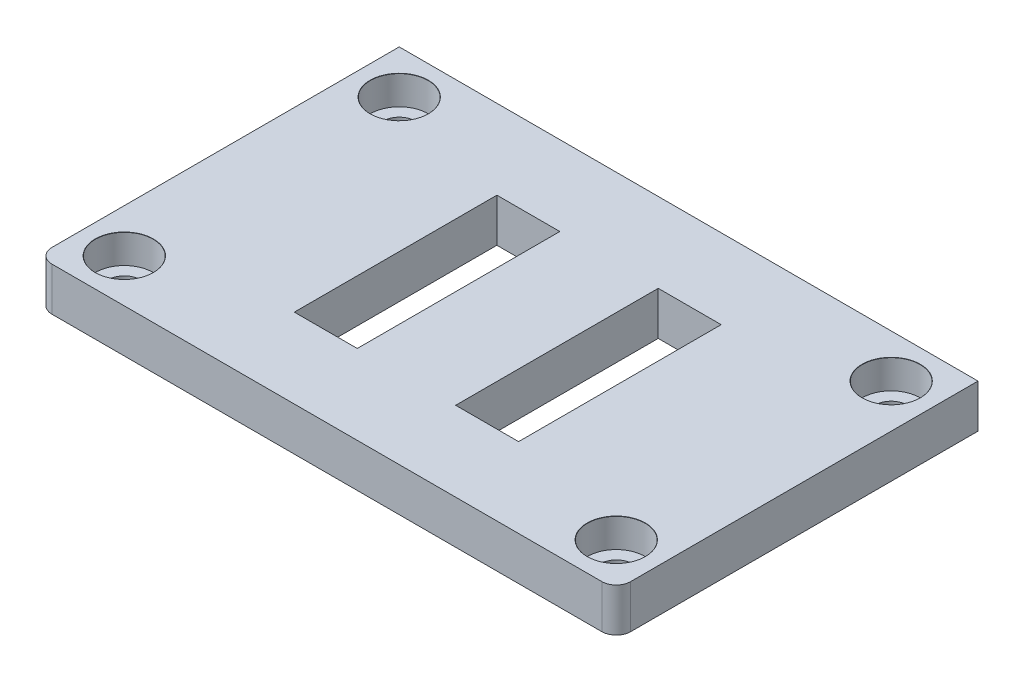
ISO-10303-21;
HEADER;
FILE_DESCRIPTION(('STEP AP214'),'2;1');
FILE_NAME('part.step','',(''),(''),'','','');
FILE_SCHEMA(('AUTOMOTIVE_DESIGN { 1 0 10303 214 1 1 1 1 }'));
ENDSEC;
DATA;
#1=APPLICATION_CONTEXT('core data for automotive mechanical design processes');
#2=APPLICATION_PROTOCOL_DEFINITION('international standard','automotive_design',2000,#1);
#3=PRODUCT_CONTEXT('',#1,'mechanical');
#4=PRODUCT('Part','Part','',(#3));
#5=PRODUCT_RELATED_PRODUCT_CATEGORY('part','',(#4));
#6=PRODUCT_DEFINITION_FORMATION('','',#4);
#7=PRODUCT_DEFINITION_CONTEXT('part definition',#1,'design');
#8=PRODUCT_DEFINITION('design','',#6,#7);
#9=PRODUCT_DEFINITION_SHAPE('','',#8);
#10=(LENGTH_UNIT() NAMED_UNIT(*) SI_UNIT(.MILLI.,.METRE.));
#11=(NAMED_UNIT(*) PLANE_ANGLE_UNIT() SI_UNIT($,.RADIAN.));
#12=(NAMED_UNIT(*) SI_UNIT($,.STERADIAN.) SOLID_ANGLE_UNIT());
#13=UNCERTAINTY_MEASURE_WITH_UNIT(LENGTH_MEASURE(1.E-05),#10,'distance_accuracy_value','');
#14=(GEOMETRIC_REPRESENTATION_CONTEXT(3) GLOBAL_UNCERTAINTY_ASSIGNED_CONTEXT((#13)) GLOBAL_UNIT_ASSIGNED_CONTEXT((#10,
#11,#12)) REPRESENTATION_CONTEXT('',''));
#15=CARTESIAN_POINT('',(0.,0.,0.));
#16=DIRECTION('',(0.,0.,1.));
#17=DIRECTION('',(1.,0.,0.));
#18=AXIS2_PLACEMENT_3D('',#15,#16,#17);
#19=CARTESIAN_POINT('',(0.,6.,0.));
#20=DIRECTION('',(0.,1.,0.));
#21=DIRECTION('',(0.,0.,1.));
#22=AXIS2_PLACEMENT_3D('',#19,#20,#21);
#23=PLANE('',#22);
#24=CARTESIAN_POINT('',(54.,6.,19.));
#25=DIRECTION('',(0.,1.,0.));
#26=DIRECTION('',(0.,0.,1.));
#27=AXIS2_PLACEMENT_3D('',#24,#25,#26);
#28=CIRCLE('',#27,4.025);
#29=CARTESIAN_POINT('',(54.,6.,23.025));
#30=VERTEX_POINT('',#29);
#31=EDGE_CURVE('E498',#30,#30,#28,.T.);
#32=ORIENTED_EDGE('',*,*,#31,.F.);
#33=EDGE_LOOP('',(#32));
#34=FACE_BOUND('',#33,.T.);
#35=CARTESIAN_POINT('',(54.,6.,-19.));
#36=DIRECTION('',(0.,1.,0.));
#37=DIRECTION('',(0.,0.,1.));
#38=AXIS2_PLACEMENT_3D('',#35,#36,#37);
#39=CIRCLE('',#38,4.025);
#40=CARTESIAN_POINT('',(54.,6.,-14.975));
#41=VERTEX_POINT('',#40);
#42=EDGE_CURVE('E516',#41,#41,#39,.T.);
#43=ORIENTED_EDGE('',*,*,#42,.F.);
#44=EDGE_LOOP('',(#43));
#45=FACE_BOUND('',#44,.T.);
#46=CARTESIAN_POINT('',(-14.,6.,19.));
#47=DIRECTION('',(0.,1.,0.));
#48=DIRECTION('',(0.,0.,1.));
#49=AXIS2_PLACEMENT_3D('',#46,#47,#48);
#50=CIRCLE('',#49,4.025);
#51=CARTESIAN_POINT('',(-14.,6.,23.025));
#52=VERTEX_POINT('',#51);
#53=EDGE_CURVE('E212',#52,#52,#50,.T.);
#54=ORIENTED_EDGE('',*,*,#53,.F.);
#55=EDGE_LOOP('',(#54));
#56=FACE_BOUND('',#55,.T.);
#57=CARTESIAN_POINT('',(-14.,6.,-19.));
#58=DIRECTION('',(0.,1.,0.));
#59=DIRECTION('',(0.,0.,1.));
#60=AXIS2_PLACEMENT_3D('',#57,#58,#59);
#61=CIRCLE('',#60,4.025);
#62=CARTESIAN_POINT('',(-14.,6.,-14.975));
#63=VERTEX_POINT('',#62);
#64=EDGE_CURVE('E232',#63,#63,#61,.T.);
#65=ORIENTED_EDGE('',*,*,#64,.F.);
#66=EDGE_LOOP('',(#65));
#67=FACE_BOUND('',#66,.T.);
#68=DIRECTION('',(1.,0.,0.));
#69=VECTOR('',#68,1.);
#70=CARTESIAN_POINT('',(-20.,6.,25.));
#71=LINE('',#70,#69);
#72=CARTESIAN_POINT('',(-18.,6.,25.));
#73=VERTEX_POINT('',#72);
#74=CARTESIAN_POINT('',(58.,6.,25.));
#75=VERTEX_POINT('',#74);
#76=EDGE_CURVE('E303',#73,#75,#71,.T.);
#77=ORIENTED_EDGE('',*,*,#76,.T.);
#78=CARTESIAN_POINT('',(58.,6.,23.));
#79=DIRECTION('',(0.,1.,0.));
#80=DIRECTION('',(0.,0.,1.));
#81=AXIS2_PLACEMENT_3D('',#78,#79,#80);
#82=CIRCLE('',#81,2.);
#83=CARTESIAN_POINT('',(60.,6.,23.));
#84=VERTEX_POINT('',#83);
#85=EDGE_CURVE('E51',#75,#84,#82,.T.);
#86=ORIENTED_EDGE('',*,*,#85,.T.);
#87=DIRECTION('',(0.,0.,1.));
#88=VECTOR('',#87,1.);
#89=CARTESIAN_POINT('',(60.,6.,-25.));
#90=LINE('',#89,#88);
#91=CARTESIAN_POINT('',(60.,6.,-25.));
#92=VERTEX_POINT('',#91);
#93=EDGE_CURVE('E201',#92,#84,#90,.T.);
#94=ORIENTED_EDGE('',*,*,#93,.F.);
#95=DIRECTION('',(-1.,0.,0.));
#96=VECTOR('',#95,1.);
#97=CARTESIAN_POINT('',(-20.,6.,-25.));
#98=LINE('',#97,#96);
#99=CARTESIAN_POINT('',(-20.,6.,-25.));
#100=VERTEX_POINT('',#99);
#101=EDGE_CURVE('E296',#92,#100,#98,.T.);
#102=ORIENTED_EDGE('',*,*,#101,.T.);
#103=DIRECTION('',(0.,0.,1.));
#104=VECTOR('',#103,1.);
#105=CARTESIAN_POINT('',(-20.,6.,-25.));
#106=LINE('',#105,#104);
#107=CARTESIAN_POINT('',(-20.,6.,23.));
#108=VERTEX_POINT('',#107);
#109=EDGE_CURVE('E299',#100,#108,#106,.T.);
#110=ORIENTED_EDGE('',*,*,#109,.T.);
#111=CARTESIAN_POINT('',(-18.,6.,23.));
#112=DIRECTION('',(0.,1.,0.));
#113=DIRECTION('',(0.,0.,1.));
#114=AXIS2_PLACEMENT_3D('',#111,#112,#113);
#115=CIRCLE('',#114,2.);
#116=EDGE_CURVE('E333',#108,#73,#115,.T.);
#117=ORIENTED_EDGE('',*,*,#116,.T.);
#118=EDGE_LOOP('',(#77,#86,#94,#102,#110,#117));
#119=FACE_BOUND('',#118,.T.);
#120=DIRECTION('',(0.,0.,-1.));
#121=VECTOR('',#120,1.);
#122=CARTESIAN_POINT('',(13.2,6.,-14.));
#123=LINE('',#122,#121);
#124=CARTESIAN_POINT('',(13.2,6.,14.));
#125=VERTEX_POINT('',#124);
#126=CARTESIAN_POINT('',(13.2,6.,-14.));
#127=VERTEX_POINT('',#126);
#128=EDGE_CURVE('E256',#125,#127,#123,.T.);
#129=ORIENTED_EDGE('',*,*,#128,.F.);
#130=DIRECTION('',(1.,0.,0.));
#131=VECTOR('',#130,1.);
#132=CARTESIAN_POINT('',(4.5,6.,14.));
#133=LINE('',#132,#131);
#134=CARTESIAN_POINT('',(4.5,6.,14.));
#135=VERTEX_POINT('',#134);
#136=EDGE_CURVE('E253',#135,#125,#133,.T.);
#137=ORIENTED_EDGE('',*,*,#136,.F.);
#138=DIRECTION('',(0.,0.,1.));
#139=VECTOR('',#138,1.);
#140=CARTESIAN_POINT('',(4.5,6.,14.));
#141=LINE('',#140,#139);
#142=CARTESIAN_POINT('',(4.5,6.,-14.));
#143=VERTEX_POINT('',#142);
#144=EDGE_CURVE('E264',#143,#135,#141,.T.);
#145=ORIENTED_EDGE('',*,*,#144,.F.);
#146=DIRECTION('',(-1.,0.,0.));
#147=VECTOR('',#146,1.);
#148=CARTESIAN_POINT('',(13.2,6.,-14.));
#149=LINE('',#148,#147);
#150=EDGE_CURVE('E260',#127,#143,#149,.T.);
#151=ORIENTED_EDGE('',*,*,#150,.F.);
#152=EDGE_LOOP('',(#129,#137,#145,#151));
#153=FACE_BOUND('',#152,.T.);
#154=DIRECTION('',(-1.,0.,0.));
#155=VECTOR('',#154,1.);
#156=CARTESIAN_POINT('',(35.5,6.,14.));
#157=LINE('',#156,#155);
#158=CARTESIAN_POINT('',(35.5,6.,14.));
#159=VERTEX_POINT('',#158);
#160=CARTESIAN_POINT('',(26.8,6.,14.));
#161=VERTEX_POINT('',#160);
#162=EDGE_CURVE('E161',#159,#161,#157,.T.);
#163=ORIENTED_EDGE('',*,*,#162,.T.);
#164=DIRECTION('',(0.,0.,-1.));
#165=VECTOR('',#164,1.);
#166=CARTESIAN_POINT('',(26.8,6.,-14.));
#167=LINE('',#166,#165);
#168=CARTESIAN_POINT('',(26.8,6.,-14.));
#169=VERTEX_POINT('',#168);
#170=EDGE_CURVE('E175',#161,#169,#167,.T.);
#171=ORIENTED_EDGE('',*,*,#170,.T.);
#172=DIRECTION('',(1.,0.,0.));
#173=VECTOR('',#172,1.);
#174=CARTESIAN_POINT('',(26.8,6.,-14.));
#175=LINE('',#174,#173);
#176=CARTESIAN_POINT('',(35.5,6.,-14.));
#177=VERTEX_POINT('',#176);
#178=EDGE_CURVE('E171',#169,#177,#175,.T.);
#179=ORIENTED_EDGE('',*,*,#178,.T.);
#180=DIRECTION('',(0.,0.,1.));
#181=VECTOR('',#180,1.);
#182=CARTESIAN_POINT('',(35.5,6.,14.));
#183=LINE('',#182,#181);
#184=EDGE_CURVE('E150',#177,#159,#183,.T.);
#185=ORIENTED_EDGE('',*,*,#184,.T.);
#186=EDGE_LOOP('',(#163,#171,#179,#185));
#187=FACE_BOUND('',#186,.T.);
#188=ADVANCED_FACE('F42',(#34,#45,#56,#67,#119,#153,#187),#23,.T.);
#189=CARTESIAN_POINT('',(0.,0.,0.));
#190=DIRECTION('',(0.,1.,0.));
#191=DIRECTION('',(0.,0.,1.));
#192=AXIS2_PLACEMENT_3D('',#189,#190,#191);
#193=PLANE('',#192);
#194=CARTESIAN_POINT('',(54.,0.,19.));
#195=DIRECTION('',(0.,1.,0.));
#196=DIRECTION('',(0.,0.,1.));
#197=AXIS2_PLACEMENT_3D('',#194,#195,#196);
#198=CIRCLE('',#197,2.25);
#199=CARTESIAN_POINT('',(54.,0.,21.25));
#200=VERTEX_POINT('',#199);
#201=EDGE_CURVE('E512',#200,#200,#198,.T.);
#202=ORIENTED_EDGE('',*,*,#201,.T.);
#203=EDGE_LOOP('',(#202));
#204=FACE_BOUND('',#203,.T.);
#205=CARTESIAN_POINT('',(54.,0.,-19.));
#206=DIRECTION('',(0.,1.,0.));
#207=DIRECTION('',(0.,0.,1.));
#208=AXIS2_PLACEMENT_3D('',#205,#206,#207);
#209=CIRCLE('',#208,2.25);
#210=CARTESIAN_POINT('',(54.,0.,-16.75));
#211=VERTEX_POINT('',#210);
#212=EDGE_CURVE('E184',#211,#211,#209,.T.);
#213=ORIENTED_EDGE('',*,*,#212,.T.);
#214=EDGE_LOOP('',(#213));
#215=FACE_BOUND('',#214,.T.);
#216=CARTESIAN_POINT('',(-14.,0.,19.));
#217=DIRECTION('',(0.,1.,0.));
#218=DIRECTION('',(0.,0.,1.));
#219=AXIS2_PLACEMENT_3D('',#216,#217,#218);
#220=CIRCLE('',#219,2.25);
#221=CARTESIAN_POINT('',(-14.,0.,21.25));
#222=VERTEX_POINT('',#221);
#223=EDGE_CURVE('E228',#222,#222,#220,.T.);
#224=ORIENTED_EDGE('',*,*,#223,.T.);
#225=EDGE_LOOP('',(#224));
#226=FACE_BOUND('',#225,.T.);
#227=CARTESIAN_POINT('',(-14.,0.,-19.));
#228=DIRECTION('',(0.,1.,0.));
#229=DIRECTION('',(0.,0.,1.));
#230=AXIS2_PLACEMENT_3D('',#227,#228,#229);
#231=CIRCLE('',#230,2.25);
#232=CARTESIAN_POINT('',(-14.,0.,-16.75));
#233=VERTEX_POINT('',#232);
#234=EDGE_CURVE('E248',#233,#233,#231,.T.);
#235=ORIENTED_EDGE('',*,*,#234,.T.);
#236=EDGE_LOOP('',(#235));
#237=FACE_BOUND('',#236,.T.);
#238=DIRECTION('',(0.,0.,1.));
#239=VECTOR('',#238,1.);
#240=CARTESIAN_POINT('',(60.,0.,-25.));
#241=LINE('',#240,#239);
#242=CARTESIAN_POINT('',(60.,0.,-25.));
#243=VERTEX_POINT('',#242);
#244=CARTESIAN_POINT('',(60.,0.,23.));
#245=VERTEX_POINT('',#244);
#246=EDGE_CURVE('E157',#243,#245,#241,.T.);
#247=ORIENTED_EDGE('',*,*,#246,.T.);
#248=CARTESIAN_POINT('',(58.,0.,23.));
#249=DIRECTION('',(0.,1.,0.));
#250=DIRECTION('',(0.,0.,1.));
#251=AXIS2_PLACEMENT_3D('',#248,#249,#250);
#252=CIRCLE('',#251,2.);
#253=CARTESIAN_POINT('',(58.,0.,25.));
#254=VERTEX_POINT('',#253);
#255=EDGE_CURVE('E324',#245,#254,#252,.F.);
#256=ORIENTED_EDGE('',*,*,#255,.T.);
#257=DIRECTION('',(1.,0.,0.));
#258=VECTOR('',#257,1.);
#259=CARTESIAN_POINT('',(-20.,0.,25.));
#260=LINE('',#259,#258);
#261=CARTESIAN_POINT('',(-18.,0.,25.));
#262=VERTEX_POINT('',#261);
#263=EDGE_CURVE('E300',#262,#254,#260,.T.);
#264=ORIENTED_EDGE('',*,*,#263,.F.);
#265=CARTESIAN_POINT('',(-18.,0.,23.));
#266=DIRECTION('',(0.,1.,0.));
#267=DIRECTION('',(0.,0.,1.));
#268=AXIS2_PLACEMENT_3D('',#265,#266,#267);
#269=CIRCLE('',#268,2.);
#270=CARTESIAN_POINT('',(-20.,0.,23.));
#271=VERTEX_POINT('',#270);
#272=EDGE_CURVE('E321',#262,#271,#269,.F.);
#273=ORIENTED_EDGE('',*,*,#272,.T.);
#274=DIRECTION('',(0.,0.,1.));
#275=VECTOR('',#274,1.);
#276=CARTESIAN_POINT('',(-20.,0.,-25.));
#277=LINE('',#276,#275);
#278=CARTESIAN_POINT('',(-20.,0.,-25.));
#279=VERTEX_POINT('',#278);
#280=EDGE_CURVE('E309',#279,#271,#277,.T.);
#281=ORIENTED_EDGE('',*,*,#280,.F.);
#282=DIRECTION('',(-1.,0.,0.));
#283=VECTOR('',#282,1.);
#284=CARTESIAN_POINT('',(-20.,0.,-25.));
#285=LINE('',#284,#283);
#286=EDGE_CURVE('E295',#243,#279,#285,.T.);
#287=ORIENTED_EDGE('',*,*,#286,.F.);
#288=EDGE_LOOP('',(#247,#256,#264,#273,#281,#287));
#289=FACE_BOUND('',#288,.T.);
#290=DIRECTION('',(1.,0.,0.));
#291=VECTOR('',#290,1.);
#292=CARTESIAN_POINT('',(4.5,0.,14.));
#293=LINE('',#292,#291);
#294=CARTESIAN_POINT('',(4.5,0.,14.));
#295=VERTEX_POINT('',#294);
#296=CARTESIAN_POINT('',(13.2,0.,14.));
#297=VERTEX_POINT('',#296);
#298=EDGE_CURVE('E252',#295,#297,#293,.T.);
#299=ORIENTED_EDGE('',*,*,#298,.T.);
#300=DIRECTION('',(0.,0.,-1.));
#301=VECTOR('',#300,1.);
#302=CARTESIAN_POINT('',(13.2,0.,-14.));
#303=LINE('',#302,#301);
#304=CARTESIAN_POINT('',(13.2,0.,-14.));
#305=VERTEX_POINT('',#304);
#306=EDGE_CURVE('E271',#297,#305,#303,.T.);
#307=ORIENTED_EDGE('',*,*,#306,.T.);
#308=DIRECTION('',(-1.,0.,0.));
#309=VECTOR('',#308,1.);
#310=CARTESIAN_POINT('',(13.2,0.,-14.));
#311=LINE('',#310,#309);
#312=CARTESIAN_POINT('',(4.5,0.,-14.));
#313=VERTEX_POINT('',#312);
#314=EDGE_CURVE('E275',#305,#313,#311,.T.);
#315=ORIENTED_EDGE('',*,*,#314,.T.);
#316=DIRECTION('',(0.,0.,1.));
#317=VECTOR('',#316,1.);
#318=CARTESIAN_POINT('',(4.5,0.,14.));
#319=LINE('',#318,#317);
#320=EDGE_CURVE('E257',#313,#295,#319,.T.);
#321=ORIENTED_EDGE('',*,*,#320,.T.);
#322=EDGE_LOOP('',(#299,#307,#315,#321));
#323=FACE_BOUND('',#322,.T.);
#324=DIRECTION('',(0.,0.,-1.));
#325=VECTOR('',#324,1.);
#326=CARTESIAN_POINT('',(26.8,0.,-14.));
#327=LINE('',#326,#325);
#328=CARTESIAN_POINT('',(26.8,0.,14.));
#329=VERTEX_POINT('',#328);
#330=CARTESIAN_POINT('',(26.8,0.,-14.));
#331=VERTEX_POINT('',#330);
#332=EDGE_CURVE('E169',#329,#331,#327,.T.);
#333=ORIENTED_EDGE('',*,*,#332,.F.);
#334=DIRECTION('',(-1.,0.,0.));
#335=VECTOR('',#334,1.);
#336=CARTESIAN_POINT('',(35.5,0.,14.));
#337=LINE('',#336,#335);
#338=CARTESIAN_POINT('',(35.5,0.,14.));
#339=VERTEX_POINT('',#338);
#340=EDGE_CURVE('E181',#339,#329,#337,.T.);
#341=ORIENTED_EDGE('',*,*,#340,.F.);
#342=DIRECTION('',(0.,0.,1.));
#343=VECTOR('',#342,1.);
#344=CARTESIAN_POINT('',(35.5,0.,14.));
#345=LINE('',#344,#343);
#346=CARTESIAN_POINT('',(35.5,0.,-14.));
#347=VERTEX_POINT('',#346);
#348=EDGE_CURVE('E153',#347,#339,#345,.T.);
#349=ORIENTED_EDGE('',*,*,#348,.F.);
#350=DIRECTION('',(1.,0.,0.));
#351=VECTOR('',#350,1.);
#352=CARTESIAN_POINT('',(26.8,0.,-14.));
#353=LINE('',#352,#351);
#354=EDGE_CURVE('E187',#331,#347,#353,.T.);
#355=ORIENTED_EDGE('',*,*,#354,.F.);
#356=EDGE_LOOP('',(#333,#341,#349,#355));
#357=FACE_BOUND('',#356,.T.);
#358=ADVANCED_FACE('F349',(#204,#215,#226,#237,#289,#323,#357),#193,.F.);
#359=CARTESIAN_POINT('',(-20.,6.,-25.));
#360=DIRECTION('',(0.,0.,1.));
#361=DIRECTION('',(1.,0.,0.));
#362=AXIS2_PLACEMENT_3D('',#359,#360,#361);
#363=PLANE('',#362);
#364=ORIENTED_EDGE('',*,*,#286,.T.);
#365=DIRECTION('',(0.,-1.,0.));
#366=VECTOR('',#365,1.);
#367=CARTESIAN_POINT('',(-20.,6.,-25.));
#368=LINE('',#367,#366);
#369=EDGE_CURVE('E306',#100,#279,#368,.T.);
#370=ORIENTED_EDGE('',*,*,#369,.F.);
#371=ORIENTED_EDGE('',*,*,#101,.F.);
#372=DIRECTION('',(0.,-1.,0.));
#373=VECTOR('',#372,1.);
#374=CARTESIAN_POINT('',(60.,6.,-25.));
#375=LINE('',#374,#373);
#376=EDGE_CURVE('E205',#92,#243,#375,.T.);
#377=ORIENTED_EDGE('',*,*,#376,.T.);
#378=EDGE_LOOP('',(#364,#370,#371,#377));
#379=FACE_BOUND('',#378,.T.);
#380=ADVANCED_FACE('F359',(#379),#363,.F.);
#381=CARTESIAN_POINT('',(-20.,6.,-25.));
#382=DIRECTION('',(1.,0.,0.));
#383=DIRECTION('',(0.,0.,-1.));
#384=AXIS2_PLACEMENT_3D('',#381,#382,#383);
#385=PLANE('',#384);
#386=ORIENTED_EDGE('',*,*,#280,.T.);
#387=DIRECTION('',(0.,-1.,0.));
#388=VECTOR('',#387,1.);
#389=CARTESIAN_POINT('',(-20.,6.,23.));
#390=LINE('',#389,#388);
#391=EDGE_CURVE('E11',#271,#108,#390,.F.);
#392=ORIENTED_EDGE('',*,*,#391,.T.);
#393=ORIENTED_EDGE('',*,*,#109,.F.);
#394=ORIENTED_EDGE('',*,*,#369,.T.);
#395=EDGE_LOOP('',(#386,#392,#393,#394));
#396=FACE_BOUND('',#395,.T.);
#397=ADVANCED_FACE('F356',(#396),#385,.F.);
#398=CARTESIAN_POINT('',(-20.,6.,25.));
#399=DIRECTION('',(0.,0.,-1.));
#400=DIRECTION('',(-1.,0.,0.));
#401=AXIS2_PLACEMENT_3D('',#398,#399,#400);
#402=PLANE('',#401);
#403=ORIENTED_EDGE('',*,*,#263,.T.);
#404=DIRECTION('',(0.,-1.,0.));
#405=VECTOR('',#404,1.);
#406=CARTESIAN_POINT('',(58.,6.,25.));
#407=LINE('',#406,#405);
#408=EDGE_CURVE('E64',#254,#75,#407,.F.);
#409=ORIENTED_EDGE('',*,*,#408,.T.);
#410=ORIENTED_EDGE('',*,*,#76,.F.);
#411=DIRECTION('',(0.,-1.,0.));
#412=VECTOR('',#411,1.);
#413=CARTESIAN_POINT('',(-18.,6.,25.));
#414=LINE('',#413,#412);
#415=EDGE_CURVE('E327',#73,#262,#414,.T.);
#416=ORIENTED_EDGE('',*,*,#415,.T.);
#417=EDGE_LOOP('',(#403,#409,#410,#416));
#418=FACE_BOUND('',#417,.T.);
#419=ADVANCED_FACE('F351',(#418),#402,.F.);
#420=CARTESIAN_POINT('',(4.5,6.,14.));
#421=DIRECTION('',(0.,0.,-1.));
#422=DIRECTION('',(-1.,0.,0.));
#423=AXIS2_PLACEMENT_3D('',#420,#421,#422);
#424=PLANE('',#423);
#425=ORIENTED_EDGE('',*,*,#298,.F.);
#426=DIRECTION('',(0.,-1.,0.));
#427=VECTOR('',#426,1.);
#428=CARTESIAN_POINT('',(4.5,6.,14.));
#429=LINE('',#428,#427);
#430=EDGE_CURVE('E267',#135,#295,#429,.T.);
#431=ORIENTED_EDGE('',*,*,#430,.F.);
#432=ORIENTED_EDGE('',*,*,#136,.T.);
#433=DIRECTION('',(0.,-1.,0.));
#434=VECTOR('',#433,1.);
#435=CARTESIAN_POINT('',(13.2,6.,14.));
#436=LINE('',#435,#434);
#437=EDGE_CURVE('E291',#125,#297,#436,.T.);
#438=ORIENTED_EDGE('',*,*,#437,.T.);
#439=EDGE_LOOP('',(#425,#431,#432,#438));
#440=FACE_BOUND('',#439,.T.);
#441=ADVANCED_FACE('F380',(#440),#424,.T.);
#442=CARTESIAN_POINT('',(13.2,6.,-14.));
#443=DIRECTION('',(-1.,0.,0.));
#444=DIRECTION('',(0.,0.,1.));
#445=AXIS2_PLACEMENT_3D('',#442,#443,#444);
#446=PLANE('',#445);
#447=ORIENTED_EDGE('',*,*,#306,.F.);
#448=ORIENTED_EDGE('',*,*,#437,.F.);
#449=ORIENTED_EDGE('',*,*,#128,.T.);
#450=DIRECTION('',(0.,-1.,0.));
#451=VECTOR('',#450,1.);
#452=CARTESIAN_POINT('',(13.2,6.,-14.));
#453=LINE('',#452,#451);
#454=EDGE_CURVE('E288',#127,#305,#453,.T.);
#455=ORIENTED_EDGE('',*,*,#454,.T.);
#456=EDGE_LOOP('',(#447,#448,#449,#455));
#457=FACE_BOUND('',#456,.T.);
#458=ADVANCED_FACE('F388',(#457),#446,.T.);
#459=CARTESIAN_POINT('',(13.2,6.,-14.));
#460=DIRECTION('',(0.,0.,1.));
#461=DIRECTION('',(1.,0.,0.));
#462=AXIS2_PLACEMENT_3D('',#459,#460,#461);
#463=PLANE('',#462);
#464=ORIENTED_EDGE('',*,*,#314,.F.);
#465=ORIENTED_EDGE('',*,*,#454,.F.);
#466=ORIENTED_EDGE('',*,*,#150,.T.);
#467=DIRECTION('',(0.,-1.,0.));
#468=VECTOR('',#467,1.);
#469=CARTESIAN_POINT('',(4.5,6.,-14.));
#470=LINE('',#469,#468);
#471=EDGE_CURVE('E285',#143,#313,#470,.T.);
#472=ORIENTED_EDGE('',*,*,#471,.T.);
#473=EDGE_LOOP('',(#464,#465,#466,#472));
#474=FACE_BOUND('',#473,.T.);
#475=ADVANCED_FACE('F393',(#474),#463,.T.);
#476=CARTESIAN_POINT('',(4.5,6.,14.));
#477=DIRECTION('',(1.,0.,0.));
#478=DIRECTION('',(0.,0.,-1.));
#479=AXIS2_PLACEMENT_3D('',#476,#477,#478);
#480=PLANE('',#479);
#481=ORIENTED_EDGE('',*,*,#320,.F.);
#482=ORIENTED_EDGE('',*,*,#471,.F.);
#483=ORIENTED_EDGE('',*,*,#144,.T.);
#484=ORIENTED_EDGE('',*,*,#430,.T.);
#485=EDGE_LOOP('',(#481,#482,#483,#484));
#486=FACE_BOUND('',#485,.T.);
#487=ADVANCED_FACE('F400',(#486),#480,.T.);
#488=CARTESIAN_POINT('',(-14.,6.,-19.));
#489=DIRECTION('',(0.,1.,0.));
#490=DIRECTION('',(0.,0.,1.));
#491=AXIS2_PLACEMENT_3D('',#488,#489,#490);
#492=CYLINDRICAL_SURFACE('',#491,2.25);
#493=ORIENTED_EDGE('',*,*,#234,.F.);
#494=EDGE_LOOP('',(#493));
#495=FACE_BOUND('',#494,.T.);
#496=CARTESIAN_POINT('',(-14.,2.,-19.));
#497=DIRECTION('',(0.,1.,0.));
#498=DIRECTION('',(0.,0.,1.));
#499=AXIS2_PLACEMENT_3D('',#496,#497,#498);
#500=CIRCLE('',#499,2.25);
#501=CARTESIAN_POINT('',(-14.,2.,-16.75));
#502=VERTEX_POINT('',#501);
#503=EDGE_CURVE('E244',#502,#502,#500,.T.);
#504=ORIENTED_EDGE('',*,*,#503,.T.);
#505=EDGE_LOOP('',(#504));
#506=FACE_BOUND('',#505,.T.);
#507=ADVANCED_FACE('F413',(#495,#506),#492,.F.);
#508=CARTESIAN_POINT('',(-10.,2.,-19.));
#509=DIRECTION('',(0.,-1.,0.));
#510=DIRECTION('',(0.,0.,-1.));
#511=AXIS2_PLACEMENT_3D('',#508,#509,#510);
#512=PLANE('',#511);
#513=ORIENTED_EDGE('',*,*,#503,.F.);
#514=EDGE_LOOP('',(#513));
#515=FACE_BOUND('',#514,.T.);
#516=CARTESIAN_POINT('',(-14.,2.,-19.));
#517=DIRECTION('',(0.,1.,0.));
#518=DIRECTION('',(0.,0.,1.));
#519=AXIS2_PLACEMENT_3D('',#516,#517,#518);
#520=CIRCLE('',#519,4.);
#521=CARTESIAN_POINT('',(-14.,2.,-15.));
#522=VERTEX_POINT('',#521);
#523=EDGE_CURVE('E240',#522,#522,#520,.T.);
#524=ORIENTED_EDGE('',*,*,#523,.T.);
#525=EDGE_LOOP('',(#524));
#526=FACE_BOUND('',#525,.T.);
#527=ADVANCED_FACE('F418',(#515,#526),#512,.F.);
#528=CARTESIAN_POINT('',(-14.,6.,-19.));
#529=DIRECTION('',(0.,1.,0.));
#530=DIRECTION('',(0.,0.,1.));
#531=AXIS2_PLACEMENT_3D('',#528,#529,#530);
#532=CYLINDRICAL_SURFACE('',#531,4.);
#533=ORIENTED_EDGE('',*,*,#523,.F.);
#534=EDGE_LOOP('',(#533));
#535=FACE_BOUND('',#534,.T.);
#536=CARTESIAN_POINT('',(-14.,5.975,-19.));
#537=DIRECTION('',(0.,1.,0.));
#538=DIRECTION('',(0.,0.,1.));
#539=AXIS2_PLACEMENT_3D('',#536,#537,#538);
#540=CIRCLE('',#539,4.);
#541=CARTESIAN_POINT('',(-14.,5.975,-15.));
#542=VERTEX_POINT('',#541);
#543=EDGE_CURVE('E236',#542,#542,#540,.T.);
#544=ORIENTED_EDGE('',*,*,#543,.T.);
#545=EDGE_LOOP('',(#544));
#546=FACE_BOUND('',#545,.T.);
#547=ADVANCED_FACE('F422',(#535,#546),#532,.F.);
#548=CARTESIAN_POINT('',(-14.,6.,-19.));
#549=DIRECTION('',(0.,1.,0.));
#550=DIRECTION('',(0.,0.,1.));
#551=AXIS2_PLACEMENT_3D('',#548,#549,#550);
#552=CONICAL_SURFACE('',#551,4.025,0.785398163397448);
#553=ORIENTED_EDGE('',*,*,#543,.F.);
#554=EDGE_LOOP('',(#553));
#555=FACE_BOUND('',#554,.T.);
#556=ORIENTED_EDGE('',*,*,#64,.T.);
#557=EDGE_LOOP('',(#556));
#558=FACE_BOUND('',#557,.T.);
#559=ADVANCED_FACE('F426',(#555,#558),#552,.F.);
#560=CARTESIAN_POINT('',(-14.,6.,19.));
#561=DIRECTION('',(0.,1.,0.));
#562=DIRECTION('',(0.,0.,1.));
#563=AXIS2_PLACEMENT_3D('',#560,#561,#562);
#564=CYLINDRICAL_SURFACE('',#563,2.25);
#565=ORIENTED_EDGE('',*,*,#223,.F.);
#566=EDGE_LOOP('',(#565));
#567=FACE_BOUND('',#566,.T.);
#568=CARTESIAN_POINT('',(-14.,2.,19.));
#569=DIRECTION('',(0.,1.,0.));
#570=DIRECTION('',(0.,0.,1.));
#571=AXIS2_PLACEMENT_3D('',#568,#569,#570);
#572=CIRCLE('',#571,2.25);
#573=CARTESIAN_POINT('',(-14.,2.,21.25));
#574=VERTEX_POINT('',#573);
#575=EDGE_CURVE('E224',#574,#574,#572,.T.);
#576=ORIENTED_EDGE('',*,*,#575,.T.);
#577=EDGE_LOOP('',(#576));
#578=FACE_BOUND('',#577,.T.);
#579=ADVANCED_FACE('F430',(#567,#578),#564,.F.);
#580=CARTESIAN_POINT('',(-10.,2.,19.));
#581=DIRECTION('',(0.,-1.,0.));
#582=DIRECTION('',(0.,0.,-1.));
#583=AXIS2_PLACEMENT_3D('',#580,#581,#582);
#584=PLANE('',#583);
#585=ORIENTED_EDGE('',*,*,#575,.F.);
#586=EDGE_LOOP('',(#585));
#587=FACE_BOUND('',#586,.T.);
#588=CARTESIAN_POINT('',(-14.,2.,19.));
#589=DIRECTION('',(0.,1.,0.));
#590=DIRECTION('',(0.,0.,1.));
#591=AXIS2_PLACEMENT_3D('',#588,#589,#590);
#592=CIRCLE('',#591,4.);
#593=CARTESIAN_POINT('',(-14.,2.,23.));
#594=VERTEX_POINT('',#593);
#595=EDGE_CURVE('E220',#594,#594,#592,.T.);
#596=ORIENTED_EDGE('',*,*,#595,.T.);
#597=EDGE_LOOP('',(#596));
#598=FACE_BOUND('',#597,.T.);
#599=ADVANCED_FACE('F434',(#587,#598),#584,.F.);
#600=CARTESIAN_POINT('',(-14.,6.,19.));
#601=DIRECTION('',(0.,1.,0.));
#602=DIRECTION('',(0.,0.,1.));
#603=AXIS2_PLACEMENT_3D('',#600,#601,#602);
#604=CYLINDRICAL_SURFACE('',#603,4.);
#605=ORIENTED_EDGE('',*,*,#595,.F.);
#606=EDGE_LOOP('',(#605));
#607=FACE_BOUND('',#606,.T.);
#608=CARTESIAN_POINT('',(-14.,5.975,19.));
#609=DIRECTION('',(0.,1.,0.));
#610=DIRECTION('',(0.,0.,1.));
#611=AXIS2_PLACEMENT_3D('',#608,#609,#610);
#612=CIRCLE('',#611,4.);
#613=CARTESIAN_POINT('',(-14.,5.975,23.));
#614=VERTEX_POINT('',#613);
#615=EDGE_CURVE('E216',#614,#614,#612,.T.);
#616=ORIENTED_EDGE('',*,*,#615,.T.);
#617=EDGE_LOOP('',(#616));
#618=FACE_BOUND('',#617,.T.);
#619=ADVANCED_FACE('F438',(#607,#618),#604,.F.);
#620=CARTESIAN_POINT('',(-14.,6.,19.));
#621=DIRECTION('',(0.,1.,0.));
#622=DIRECTION('',(0.,0.,1.));
#623=AXIS2_PLACEMENT_3D('',#620,#621,#622);
#624=CONICAL_SURFACE('',#623,4.025,0.785398163397448);
#625=ORIENTED_EDGE('',*,*,#615,.F.);
#626=EDGE_LOOP('',(#625));
#627=FACE_BOUND('',#626,.T.);
#628=ORIENTED_EDGE('',*,*,#53,.T.);
#629=EDGE_LOOP('',(#628));
#630=FACE_BOUND('',#629,.T.);
#631=ADVANCED_FACE('F442',(#627,#630),#624,.F.);
#632=CARTESIAN_POINT('',(60.,6.,-25.));
#633=DIRECTION('',(1.,0.,0.));
#634=DIRECTION('',(0.,0.,-1.));
#635=AXIS2_PLACEMENT_3D('',#632,#633,#634);
#636=PLANE('',#635);
#637=ORIENTED_EDGE('',*,*,#93,.T.);
#638=DIRECTION('',(0.,-1.,0.));
#639=VECTOR('',#638,1.);
#640=CARTESIAN_POINT('',(60.,0.,23.));
#641=LINE('',#640,#639);
#642=EDGE_CURVE('E317',#84,#245,#641,.T.);
#643=ORIENTED_EDGE('',*,*,#642,.T.);
#644=ORIENTED_EDGE('',*,*,#246,.F.);
#645=ORIENTED_EDGE('',*,*,#376,.F.);
#646=EDGE_LOOP('',(#637,#643,#644,#645));
#647=FACE_BOUND('',#646,.T.);
#648=ADVANCED_FACE('F344',(#647),#636,.T.);
#649=CARTESIAN_POINT('',(35.5,6.,14.));
#650=DIRECTION('',(0.,0.,1.));
#651=DIRECTION('',(1.,0.,0.));
#652=AXIS2_PLACEMENT_3D('',#649,#650,#651);
#653=PLANE('',#652);
#654=ORIENTED_EDGE('',*,*,#340,.T.);
#655=DIRECTION('',(0.,-1.,0.));
#656=VECTOR('',#655,1.);
#657=CARTESIAN_POINT('',(26.8,6.,14.));
#658=LINE('',#657,#656);
#659=EDGE_CURVE('E164',#161,#329,#658,.T.);
#660=ORIENTED_EDGE('',*,*,#659,.F.);
#661=ORIENTED_EDGE('',*,*,#162,.F.);
#662=DIRECTION('',(0.,-1.,0.));
#663=VECTOR('',#662,1.);
#664=CARTESIAN_POINT('',(35.5,6.,14.));
#665=LINE('',#664,#663);
#666=EDGE_CURVE('E146',#159,#339,#665,.T.);
#667=ORIENTED_EDGE('',*,*,#666,.T.);
#668=EDGE_LOOP('',(#654,#660,#661,#667));
#669=FACE_BOUND('',#668,.T.);
#670=ADVANCED_FACE('F162',(#669),#653,.F.);
#671=CARTESIAN_POINT('',(35.5,6.,14.));
#672=DIRECTION('',(1.,0.,0.));
#673=DIRECTION('',(0.,0.,-1.));
#674=AXIS2_PLACEMENT_3D('',#671,#672,#673);
#675=PLANE('',#674);
#676=ORIENTED_EDGE('',*,*,#348,.T.);
#677=ORIENTED_EDGE('',*,*,#666,.F.);
#678=ORIENTED_EDGE('',*,*,#184,.F.);
#679=DIRECTION('',(0.,-1.,0.));
#680=VECTOR('',#679,1.);
#681=CARTESIAN_POINT('',(35.5,6.,-14.));
#682=LINE('',#681,#680);
#683=EDGE_CURVE('E158',#177,#347,#682,.T.);
#684=ORIENTED_EDGE('',*,*,#683,.T.);
#685=EDGE_LOOP('',(#676,#677,#678,#684));
#686=FACE_BOUND('',#685,.T.);
#687=ADVANCED_FACE('F148',(#686),#675,.F.);
#688=CARTESIAN_POINT('',(26.8,6.,-14.));
#689=DIRECTION('',(0.,0.,-1.));
#690=DIRECTION('',(-1.,0.,0.));
#691=AXIS2_PLACEMENT_3D('',#688,#689,#690);
#692=PLANE('',#691);
#693=ORIENTED_EDGE('',*,*,#354,.T.);
#694=ORIENTED_EDGE('',*,*,#683,.F.);
#695=ORIENTED_EDGE('',*,*,#178,.F.);
#696=DIRECTION('',(0.,-1.,0.));
#697=VECTOR('',#696,1.);
#698=CARTESIAN_POINT('',(26.8,6.,-14.));
#699=LINE('',#698,#697);
#700=EDGE_CURVE('E196',#169,#331,#699,.T.);
#701=ORIENTED_EDGE('',*,*,#700,.T.);
#702=EDGE_LOOP('',(#693,#694,#695,#701));
#703=FACE_BOUND('',#702,.T.);
#704=ADVANCED_FACE('F452',(#703),#692,.F.);
#705=CARTESIAN_POINT('',(26.8,6.,-14.));
#706=DIRECTION('',(-1.,0.,0.));
#707=DIRECTION('',(0.,0.,1.));
#708=AXIS2_PLACEMENT_3D('',#705,#706,#707);
#709=PLANE('',#708);
#710=ORIENTED_EDGE('',*,*,#332,.T.);
#711=ORIENTED_EDGE('',*,*,#700,.F.);
#712=ORIENTED_EDGE('',*,*,#170,.F.);
#713=ORIENTED_EDGE('',*,*,#659,.T.);
#714=EDGE_LOOP('',(#710,#711,#712,#713));
#715=FACE_BOUND('',#714,.T.);
#716=ADVANCED_FACE('F455',(#715),#709,.F.);
#717=CARTESIAN_POINT('',(54.,6.,-19.));
#718=DIRECTION('',(0.,1.,0.));
#719=DIRECTION('',(0.,0.,1.));
#720=AXIS2_PLACEMENT_3D('',#717,#718,#719);
#721=CYLINDRICAL_SURFACE('',#720,2.25);
#722=ORIENTED_EDGE('',*,*,#212,.F.);
#723=EDGE_LOOP('',(#722));
#724=FACE_BOUND('',#723,.T.);
#725=CARTESIAN_POINT('',(54.,2.,-19.));
#726=DIRECTION('',(0.,1.,0.));
#727=DIRECTION('',(0.,0.,1.));
#728=AXIS2_PLACEMENT_3D('',#725,#726,#727);
#729=CIRCLE('',#728,2.25);
#730=CARTESIAN_POINT('',(54.,2.,-16.75));
#731=VERTEX_POINT('',#730);
#732=EDGE_CURVE('E528',#731,#731,#729,.T.);
#733=ORIENTED_EDGE('',*,*,#732,.T.);
#734=EDGE_LOOP('',(#733));
#735=FACE_BOUND('',#734,.T.);
#736=ADVANCED_FACE('F459',(#724,#735),#721,.F.);
#737=CARTESIAN_POINT('',(58.,2.,-19.));
#738=DIRECTION('',(0.,-1.,0.));
#739=DIRECTION('',(0.,0.,-1.));
#740=AXIS2_PLACEMENT_3D('',#737,#738,#739);
#741=PLANE('',#740);
#742=ORIENTED_EDGE('',*,*,#732,.F.);
#743=EDGE_LOOP('',(#742));
#744=FACE_BOUND('',#743,.T.);
#745=CARTESIAN_POINT('',(54.,2.,-19.));
#746=DIRECTION('',(0.,1.,0.));
#747=DIRECTION('',(0.,0.,1.));
#748=AXIS2_PLACEMENT_3D('',#745,#746,#747);
#749=CIRCLE('',#748,4.);
#750=CARTESIAN_POINT('',(54.,2.,-15.));
#751=VERTEX_POINT('',#750);
#752=EDGE_CURVE('E524',#751,#751,#749,.T.);
#753=ORIENTED_EDGE('',*,*,#752,.T.);
#754=EDGE_LOOP('',(#753));
#755=FACE_BOUND('',#754,.T.);
#756=ADVANCED_FACE('F463',(#744,#755),#741,.F.);
#757=CARTESIAN_POINT('',(54.,6.,-19.));
#758=DIRECTION('',(0.,1.,0.));
#759=DIRECTION('',(0.,0.,1.));
#760=AXIS2_PLACEMENT_3D('',#757,#758,#759);
#761=CYLINDRICAL_SURFACE('',#760,4.);
#762=ORIENTED_EDGE('',*,*,#752,.F.);
#763=EDGE_LOOP('',(#762));
#764=FACE_BOUND('',#763,.T.);
#765=CARTESIAN_POINT('',(54.,5.975,-19.));
#766=DIRECTION('',(0.,1.,0.));
#767=DIRECTION('',(0.,0.,1.));
#768=AXIS2_PLACEMENT_3D('',#765,#766,#767);
#769=CIRCLE('',#768,4.);
#770=CARTESIAN_POINT('',(54.,5.975,-15.));
#771=VERTEX_POINT('',#770);
#772=EDGE_CURVE('E520',#771,#771,#769,.T.);
#773=ORIENTED_EDGE('',*,*,#772,.T.);
#774=EDGE_LOOP('',(#773));
#775=FACE_BOUND('',#774,.T.);
#776=ADVANCED_FACE('F467',(#764,#775),#761,.F.);
#777=CARTESIAN_POINT('',(54.,6.,-19.));
#778=DIRECTION('',(0.,1.,0.));
#779=DIRECTION('',(0.,0.,1.));
#780=AXIS2_PLACEMENT_3D('',#777,#778,#779);
#781=CONICAL_SURFACE('',#780,4.025,0.785398163397379);
#782=ORIENTED_EDGE('',*,*,#772,.F.);
#783=EDGE_LOOP('',(#782));
#784=FACE_BOUND('',#783,.T.);
#785=ORIENTED_EDGE('',*,*,#42,.T.);
#786=EDGE_LOOP('',(#785));
#787=FACE_BOUND('',#786,.T.);
#788=ADVANCED_FACE('F471',(#784,#787),#781,.F.);
#789=CARTESIAN_POINT('',(54.,6.,19.));
#790=DIRECTION('',(0.,1.,0.));
#791=DIRECTION('',(0.,0.,1.));
#792=AXIS2_PLACEMENT_3D('',#789,#790,#791);
#793=CYLINDRICAL_SURFACE('',#792,2.25);
#794=ORIENTED_EDGE('',*,*,#201,.F.);
#795=EDGE_LOOP('',(#794));
#796=FACE_BOUND('',#795,.T.);
#797=CARTESIAN_POINT('',(54.,2.,19.));
#798=DIRECTION('',(0.,1.,0.));
#799=DIRECTION('',(0.,0.,1.));
#800=AXIS2_PLACEMENT_3D('',#797,#798,#799);
#801=CIRCLE('',#800,2.25);
#802=CARTESIAN_POINT('',(54.,2.,21.25));
#803=VERTEX_POINT('',#802);
#804=EDGE_CURVE('E508',#803,#803,#801,.T.);
#805=ORIENTED_EDGE('',*,*,#804,.T.);
#806=EDGE_LOOP('',(#805));
#807=FACE_BOUND('',#806,.T.);
#808=ADVANCED_FACE('F475',(#796,#807),#793,.F.);
#809=CARTESIAN_POINT('',(58.,2.,19.));
#810=DIRECTION('',(0.,-1.,0.));
#811=DIRECTION('',(0.,0.,-1.));
#812=AXIS2_PLACEMENT_3D('',#809,#810,#811);
#813=PLANE('',#812);
#814=ORIENTED_EDGE('',*,*,#804,.F.);
#815=EDGE_LOOP('',(#814));
#816=FACE_BOUND('',#815,.T.);
#817=CARTESIAN_POINT('',(54.,2.,19.));
#818=DIRECTION('',(0.,1.,0.));
#819=DIRECTION('',(0.,0.,1.));
#820=AXIS2_PLACEMENT_3D('',#817,#818,#819);
#821=CIRCLE('',#820,4.);
#822=CARTESIAN_POINT('',(54.,2.,23.));
#823=VERTEX_POINT('',#822);
#824=EDGE_CURVE('E502',#823,#823,#821,.T.);
#825=ORIENTED_EDGE('',*,*,#824,.T.);
#826=EDGE_LOOP('',(#825));
#827=FACE_BOUND('',#826,.T.);
#828=ADVANCED_FACE('F479',(#816,#827),#813,.F.);
#829=CARTESIAN_POINT('',(54.,6.,19.));
#830=DIRECTION('',(0.,1.,0.));
#831=DIRECTION('',(0.,0.,1.));
#832=AXIS2_PLACEMENT_3D('',#829,#830,#831);
#833=CYLINDRICAL_SURFACE('',#832,4.);
#834=ORIENTED_EDGE('',*,*,#824,.F.);
#835=EDGE_LOOP('',(#834));
#836=FACE_BOUND('',#835,.T.);
#837=CARTESIAN_POINT('',(54.,5.975,19.));
#838=DIRECTION('',(0.,1.,0.));
#839=DIRECTION('',(0.,0.,1.));
#840=AXIS2_PLACEMENT_3D('',#837,#838,#839);
#841=CIRCLE('',#840,4.);
#842=CARTESIAN_POINT('',(54.,5.975,23.));
#843=VERTEX_POINT('',#842);
#844=EDGE_CURVE('E496',#843,#843,#841,.T.);
#845=ORIENTED_EDGE('',*,*,#844,.T.);
#846=EDGE_LOOP('',(#845));
#847=FACE_BOUND('',#846,.T.);
#848=ADVANCED_FACE('F483',(#836,#847),#833,.F.);
#849=CARTESIAN_POINT('',(54.,6.,19.));
#850=DIRECTION('',(0.,1.,0.));
#851=DIRECTION('',(0.,0.,1.));
#852=AXIS2_PLACEMENT_3D('',#849,#850,#851);
#853=CONICAL_SURFACE('',#852,4.025,0.785398163397379);
#854=ORIENTED_EDGE('',*,*,#844,.F.);
#855=EDGE_LOOP('',(#854));
#856=FACE_BOUND('',#855,.T.);
#857=ORIENTED_EDGE('',*,*,#31,.T.);
#858=EDGE_LOOP('',(#857));
#859=FACE_BOUND('',#858,.T.);
#860=ADVANCED_FACE('F487',(#856,#859),#853,.F.);
#861=CARTESIAN_POINT('',(58.,6.,23.));
#862=DIRECTION('',(0.,1.,0.));
#863=DIRECTION('',(0.,0.,1.));
#864=AXIS2_PLACEMENT_3D('',#861,#862,#863);
#865=CYLINDRICAL_SURFACE('',#864,2.);
#866=ORIENTED_EDGE('',*,*,#85,.F.);
#867=ORIENTED_EDGE('',*,*,#408,.F.);
#868=ORIENTED_EDGE('',*,*,#255,.F.);
#869=ORIENTED_EDGE('',*,*,#642,.F.);
#870=EDGE_LOOP('',(#866,#867,#868,#869));
#871=FACE_BOUND('',#870,.T.);
#872=ADVANCED_FACE('F346',(#871),#865,.T.);
#873=CARTESIAN_POINT('',(-18.,6.,23.));
#874=DIRECTION('',(0.,-1.,0.));
#875=DIRECTION('',(0.,0.,-1.));
#876=AXIS2_PLACEMENT_3D('',#873,#874,#875);
#877=CYLINDRICAL_SURFACE('',#876,2.);
#878=ORIENTED_EDGE('',*,*,#116,.F.);
#879=ORIENTED_EDGE('',*,*,#391,.F.);
#880=ORIENTED_EDGE('',*,*,#272,.F.);
#881=ORIENTED_EDGE('',*,*,#415,.F.);
#882=EDGE_LOOP('',(#878,#879,#880,#881));
#883=FACE_BOUND('',#882,.T.);
#884=ADVANCED_FACE('F44',(#883),#877,.T.);
#885=CLOSED_SHELL('',(#188,#358,#380,#397,#419,#441,#458,#475,#487,#507,#527,#547,#559,#579,
#599,#619,#631,#648,#670,#687,#704,#716,#736,#756,#776,#788,#808,#828,#848,#860,#872,#884));
#886=MANIFOLD_SOLID_BREP('B2',#885);
#887=ADVANCED_BREP_SHAPE_REPRESENTATION('',(#18,#886),#14);
#888=SHAPE_DEFINITION_REPRESENTATION(#9,#887);
ENDSEC;
END-ISO-10303-21;
